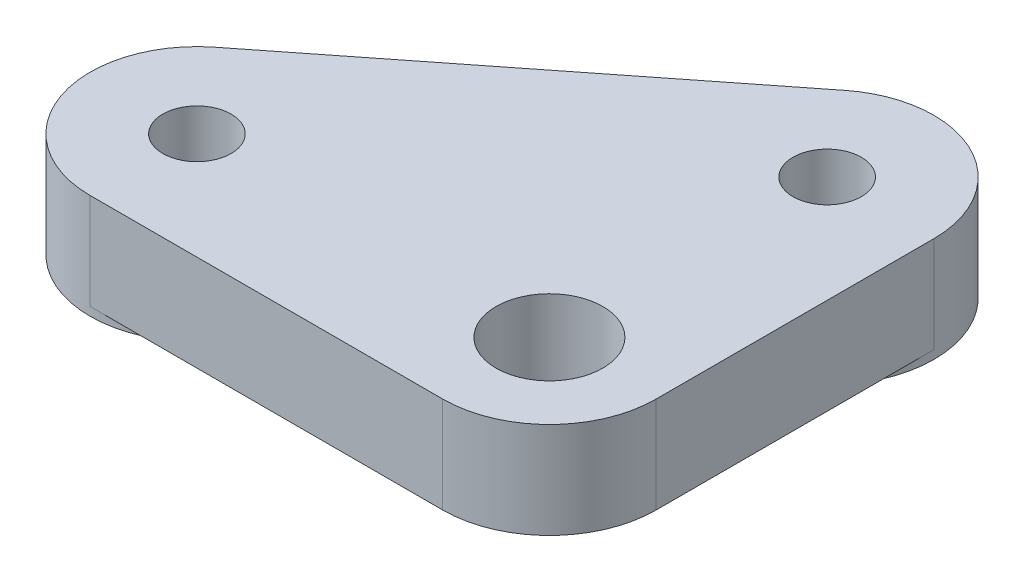
ISO-10303-21;
HEADER;
FILE_DESCRIPTION(('STEP AP214'),'2;1');
FILE_NAME('part.step','',(''),(''),'','','');
FILE_SCHEMA(('AUTOMOTIVE_DESIGN { 1 0 10303 214 1 1 1 1 }'));
ENDSEC;
DATA;
#1=APPLICATION_CONTEXT('core data for automotive mechanical design processes');
#2=APPLICATION_PROTOCOL_DEFINITION('international standard','automotive_design',2000,#1);
#3=PRODUCT_CONTEXT('',#1,'mechanical');
#4=PRODUCT('Part','Part','',(#3));
#5=PRODUCT_RELATED_PRODUCT_CATEGORY('part','',(#4));
#6=PRODUCT_DEFINITION_FORMATION('','',#4);
#7=PRODUCT_DEFINITION_CONTEXT('part definition',#1,'design');
#8=PRODUCT_DEFINITION('design','',#6,#7);
#9=PRODUCT_DEFINITION_SHAPE('','',#8);
#10=(LENGTH_UNIT() NAMED_UNIT(*) SI_UNIT(.MILLI.,.METRE.));
#11=(NAMED_UNIT(*) PLANE_ANGLE_UNIT() SI_UNIT($,.RADIAN.));
#12=(NAMED_UNIT(*) SI_UNIT($,.STERADIAN.) SOLID_ANGLE_UNIT());
#13=UNCERTAINTY_MEASURE_WITH_UNIT(LENGTH_MEASURE(1.E-05),#10,'distance_accuracy_value','');
#14=(GEOMETRIC_REPRESENTATION_CONTEXT(3) GLOBAL_UNCERTAINTY_ASSIGNED_CONTEXT((#13)) GLOBAL_UNIT_ASSIGNED_CONTEXT((#10,
#11,#12)) REPRESENTATION_CONTEXT('',''));
#15=CARTESIAN_POINT('',(0.,0.,0.));
#16=DIRECTION('',(0.,0.,1.));
#17=DIRECTION('',(1.,0.,0.));
#18=AXIS2_PLACEMENT_3D('',#15,#16,#17);
#19=CARTESIAN_POINT('',(-10.,0.,0.));
#20=DIRECTION('',(0.,1.,0.));
#21=DIRECTION('',(0.,0.,1.));
#22=AXIS2_PLACEMENT_3D('',#19,#20,#21);
#23=PLANE('',#22);
#24=CARTESIAN_POINT('',(-10.,0.,0.));
#25=DIRECTION('',(0.,-1.,0.));
#26=DIRECTION('',(0.,0.,1.));
#27=AXIS2_PLACEMENT_3D('',#24,#25,#26);
#28=CIRCLE('',#27,2.5);
#29=CARTESIAN_POINT('',(-10.,0.,2.5));
#30=VERTEX_POINT('',#29);
#31=EDGE_CURVE('E149',#30,#30,#28,.T.);
#32=ORIENTED_EDGE('',*,*,#31,.F.);
#33=EDGE_LOOP('',(#32));
#34=FACE_BOUND('',#33,.T.);
#35=CARTESIAN_POINT('',(-10.,0.,-13.));
#36=DIRECTION('',(0.,1.,0.));
#37=DIRECTION('',(0.,0.,-1.));
#38=AXIS2_PLACEMENT_3D('',#35,#36,#37);
#39=CIRCLE('',#38,4.99999999999997);
#40=CARTESIAN_POINT('',(-13.0943611330176,0.,-16.9274583611377));
#41=VERTEX_POINT('',#40);
#42=CARTESIAN_POINT('',(-5.00000000000001,0.,-13.));
#43=VERTEX_POINT('',#42);
#44=EDGE_CURVE('E104',#41,#43,#39,.T.);
#45=ORIENTED_EDGE('',*,*,#44,.T.);
#46=DIRECTION('',(0.,0.,1.));
#47=VECTOR('',#46,1.);
#48=CARTESIAN_POINT('',(-5.00000000000001,2.22044604925031E-13,-23.3048337992727));
#49=LINE('',#48,#47);
#50=CARTESIAN_POINT('',(-5.,0.,0.));
#51=VERTEX_POINT('',#50);
#52=EDGE_CURVE('E152',#43,#51,#49,.T.);
#53=ORIENTED_EDGE('',*,*,#52,.T.);
#54=CARTESIAN_POINT('',(-10.,0.,0.));
#55=DIRECTION('',(0.,-1.,0.));
#56=DIRECTION('',(0.,0.,1.));
#57=AXIS2_PLACEMENT_3D('',#54,#55,#56);
#58=CIRCLE('',#57,5.);
#59=CARTESIAN_POINT('',(-10.,1.11022302462516E-13,5.));
#60=VERTEX_POINT('',#59);
#61=EDGE_CURVE('E158',#60,#51,#58,.F.);
#62=ORIENTED_EDGE('',*,*,#61,.F.);
#63=DIRECTION('',(-1.,0.,0.));
#64=VECTOR('',#63,1.);
#65=CARTESIAN_POINT('',(-5.,1.11022302462516E-13,5.));
#66=LINE('',#65,#64);
#67=CARTESIAN_POINT('',(-26.5000000000001,1.11022302462516E-13,5.00000000000001));
#68=VERTEX_POINT('',#67);
#69=EDGE_CURVE('E107',#60,#68,#66,.T.);
#70=ORIENTED_EDGE('',*,*,#69,.T.);
#71=CARTESIAN_POINT('',(-26.5000000000001,0.,0.));
#72=DIRECTION('',(0.,1.,0.));
#73=DIRECTION('',(0.,0.,-1.));
#74=AXIS2_PLACEMENT_3D('',#71,#72,#73);
#75=CIRCLE('',#74,5.00000000000003);
#76=CARTESIAN_POINT('',(-29.5943611330177,0.,-3.9274583611377));
#77=VERTEX_POINT('',#76);
#78=EDGE_CURVE('E11',#68,#77,#75,.T.);
#79=ORIENTED_EDGE('',*,*,#78,.T.);
#80=DIRECTION('',(0.785491672227536,0.,-0.618872226603513));
#81=VECTOR('',#80,1.);
#82=CARTESIAN_POINT('',(-40.9253659760001,1.11022302462516E-13,5.00000000000001));
#83=LINE('',#82,#81);
#84=EDGE_CURVE('E94',#77,#41,#83,.T.);
#85=ORIENTED_EDGE('',*,*,#84,.T.);
#86=EDGE_LOOP('',(#45,#53,#62,#70,#79,#85));
#87=FACE_BOUND('',#86,.T.);
#88=ADVANCED_FACE('F34',(#34,#87),#23,.F.);
#89=CARTESIAN_POINT('',(-5.00000000000001,1.57000000000018,-23.3048337992727));
#90=DIRECTION('',(-1.,0.,0.));
#91=DIRECTION('',(0.,0.,-1.));
#92=AXIS2_PLACEMENT_3D('',#89,#90,#91);
#93=PLANE('',#92);
#94=DIRECTION('',(0.,-1.,0.));
#95=VECTOR('',#94,1.);
#96=CARTESIAN_POINT('',(-5.,1.56999999999996,0.));
#97=LINE('',#96,#95);
#98=CARTESIAN_POINT('',(-5.,4.49999999999996,0.));
#99=VERTEX_POINT('',#98);
#100=EDGE_CURVE('E106',#51,#99,#97,.F.);
#101=ORIENTED_EDGE('',*,*,#100,.F.);
#102=ORIENTED_EDGE('',*,*,#52,.F.);
#103=DIRECTION('',(0.,-1.,0.));
#104=VECTOR('',#103,1.);
#105=CARTESIAN_POINT('',(-5.00000000000001,1.56999999999996,-13.));
#106=LINE('',#105,#104);
#107=CARTESIAN_POINT('',(-5.00000000000006,4.49999999999996,-13.));
#108=VERTEX_POINT('',#107);
#109=EDGE_CURVE('E112',#108,#43,#106,.T.);
#110=ORIENTED_EDGE('',*,*,#109,.F.);
#111=DIRECTION('',(0.,0.,1.));
#112=VECTOR('',#111,1.);
#113=CARTESIAN_POINT('',(-5.00000000000004,4.49999999999996,-13.));
#114=LINE('',#113,#112);
#115=EDGE_CURVE('E142',#108,#99,#114,.T.);
#116=ORIENTED_EDGE('',*,*,#115,.T.);
#117=EDGE_LOOP('',(#101,#102,#110,#116));
#118=FACE_BOUND('',#117,.T.);
#119=ADVANCED_FACE('F170',(#118),#93,.F.);
#120=CARTESIAN_POINT('',(-5.,1.57000000000007,5.));
#121=DIRECTION('',(0.,0.,-1.));
#122=DIRECTION('',(1.,0.,0.));
#123=AXIS2_PLACEMENT_3D('',#120,#121,#122);
#124=PLANE('',#123);
#125=DIRECTION('',(0.,-1.,0.));
#126=VECTOR('',#125,1.);
#127=CARTESIAN_POINT('',(-26.5000000000001,1.57000000000007,5.00000000000001));
#128=LINE('',#127,#126);
#129=CARTESIAN_POINT('',(-26.5000000000001,4.49999999999996,5.00000000000001));
#130=VERTEX_POINT('',#129);
#131=EDGE_CURVE('E50',#68,#130,#128,.F.);
#132=ORIENTED_EDGE('',*,*,#131,.F.);
#133=ORIENTED_EDGE('',*,*,#69,.F.);
#134=DIRECTION('',(0.,-1.,0.));
#135=VECTOR('',#134,1.);
#136=CARTESIAN_POINT('',(-10.,1.57000000000007,5.));
#137=LINE('',#136,#135);
#138=CARTESIAN_POINT('',(-10.,4.49999999999996,5.));
#139=VERTEX_POINT('',#138);
#140=EDGE_CURVE('E38',#139,#60,#137,.T.);
#141=ORIENTED_EDGE('',*,*,#140,.F.);
#142=DIRECTION('',(-1.,0.,0.));
#143=VECTOR('',#142,1.);
#144=CARTESIAN_POINT('',(-10.,4.49999999999996,5.));
#145=LINE('',#144,#143);
#146=EDGE_CURVE('E147',#139,#130,#145,.T.);
#147=ORIENTED_EDGE('',*,*,#146,.T.);
#148=EDGE_LOOP('',(#132,#133,#141,#147));
#149=FACE_BOUND('',#148,.T.);
#150=ADVANCED_FACE('F163',(#149),#124,.F.);
#151=CARTESIAN_POINT('',(-40.9253659760001,1.57000000000007,5.00000000000001));
#152=DIRECTION('',(0.618872226603513,0.,0.785491672227536));
#153=DIRECTION('',(-0.785491672227536,0.,0.618872226603513));
#154=AXIS2_PLACEMENT_3D('',#151,#152,#153);
#155=PLANE('',#154);
#156=ORIENTED_EDGE('',*,*,#84,.F.);
#157=DIRECTION('',(0.,-1.,0.));
#158=VECTOR('',#157,1.);
#159=CARTESIAN_POINT('',(-29.5943611330177,1.56999999999996,-3.92745836113772));
#160=LINE('',#159,#158);
#161=CARTESIAN_POINT('',(-29.5943611330177,4.49999999999996,-3.92745836113772));
#162=VERTEX_POINT('',#161);
#163=EDGE_CURVE('E99',#162,#77,#160,.T.);
#164=ORIENTED_EDGE('',*,*,#163,.F.);
#165=DIRECTION('',(0.785491672227541,0.,-0.618872226603506));
#166=VECTOR('',#165,1.);
#167=CARTESIAN_POINT('',(-29.5943611330177,4.49999999999996,-3.92745836113772));
#168=LINE('',#167,#166);
#169=CARTESIAN_POINT('',(-13.0943611330175,4.49999999999996,-16.9274583611376));
#170=VERTEX_POINT('',#169);
#171=EDGE_CURVE('E96',#162,#170,#168,.T.);
#172=ORIENTED_EDGE('',*,*,#171,.T.);
#173=DIRECTION('',(0.,-1.,0.));
#174=VECTOR('',#173,1.);
#175=CARTESIAN_POINT('',(-13.0943611330175,1.56999999999996,-16.9274583611376));
#176=LINE('',#175,#174);
#177=EDGE_CURVE('E90',#41,#170,#176,.F.);
#178=ORIENTED_EDGE('',*,*,#177,.F.);
#179=EDGE_LOOP('',(#156,#164,#172,#178));
#180=FACE_BOUND('',#179,.T.);
#181=ADVANCED_FACE('F92',(#180),#155,.F.);
#182=CARTESIAN_POINT('',(-26.5000000000001,1.56999999999996,0.));
#183=DIRECTION('',(0.,-1.,0.));
#184=DIRECTION('',(0.,0.,-1.));
#185=AXIS2_PLACEMENT_3D('',#182,#183,#184);
#186=CYLINDRICAL_SURFACE('',#185,1.6);
#187=CARTESIAN_POINT('',(-26.5000000000001,4.49999999999996,0.));
#188=DIRECTION('',(0.,-1.,0.));
#189=DIRECTION('',(0.,0.,1.));
#190=AXIS2_PLACEMENT_3D('',#187,#188,#189);
#191=CIRCLE('',#190,1.6);
#192=CARTESIAN_POINT('',(-26.5000000000001,4.49999999999996,1.6));
#193=VERTEX_POINT('',#192);
#194=EDGE_CURVE('E131',#193,#193,#191,.T.);
#195=ORIENTED_EDGE('',*,*,#194,.F.);
#196=EDGE_LOOP('',(#195));
#197=FACE_BOUND('',#196,.T.);
#198=CARTESIAN_POINT('',(-26.5000000000001,-0.4,0.));
#199=DIRECTION('',(0.,1.,0.));
#200=DIRECTION('',(0.,0.,-1.));
#201=AXIS2_PLACEMENT_3D('',#198,#199,#200);
#202=CIRCLE('',#201,1.6);
#203=CARTESIAN_POINT('',(-26.5000000000001,-0.4,-1.6));
#204=VERTEX_POINT('',#203);
#205=EDGE_CURVE('E118',#204,#204,#202,.T.);
#206=ORIENTED_EDGE('',*,*,#205,.F.);
#207=EDGE_LOOP('',(#206));
#208=FACE_BOUND('',#207,.T.);
#209=ADVANCED_FACE('F189',(#197,#208),#186,.F.);
#210=CARTESIAN_POINT('',(-10.,1.56999999999996,0.));
#211=DIRECTION('',(0.,-1.,0.));
#212=DIRECTION('',(0.,0.,-1.));
#213=AXIS2_PLACEMENT_3D('',#210,#211,#212);
#214=CYLINDRICAL_SURFACE('',#213,2.5);
#215=ORIENTED_EDGE('',*,*,#31,.T.);
#216=EDGE_LOOP('',(#215));
#217=FACE_BOUND('',#216,.T.);
#218=CARTESIAN_POINT('',(-10.,4.49999999999996,0.));
#219=DIRECTION('',(0.,-1.,0.));
#220=DIRECTION('',(0.,0.,1.));
#221=AXIS2_PLACEMENT_3D('',#218,#219,#220);
#222=CIRCLE('',#221,2.5);
#223=CARTESIAN_POINT('',(-10.,4.49999999999996,2.5));
#224=VERTEX_POINT('',#223);
#225=EDGE_CURVE('E134',#224,#224,#222,.T.);
#226=ORIENTED_EDGE('',*,*,#225,.F.);
#227=EDGE_LOOP('',(#226));
#228=FACE_BOUND('',#227,.T.);
#229=ADVANCED_FACE('F208',(#217,#228),#214,.F.);
#230=CARTESIAN_POINT('',(-10.,1.56999999999996,-13.));
#231=DIRECTION('',(0.,-1.,0.));
#232=DIRECTION('',(0.,0.,-1.));
#233=AXIS2_PLACEMENT_3D('',#230,#231,#232);
#234=CYLINDRICAL_SURFACE('',#233,1.6);
#235=CARTESIAN_POINT('',(-10.,4.49999999999996,-13.));
#236=DIRECTION('',(0.,-1.,0.));
#237=DIRECTION('',(0.,0.,1.));
#238=AXIS2_PLACEMENT_3D('',#235,#236,#237);
#239=CIRCLE('',#238,1.6);
#240=CARTESIAN_POINT('',(-10.,4.49999999999996,-11.4));
#241=VERTEX_POINT('',#240);
#242=EDGE_CURVE('E127',#241,#241,#239,.T.);
#243=ORIENTED_EDGE('',*,*,#242,.F.);
#244=EDGE_LOOP('',(#243));
#245=FACE_BOUND('',#244,.T.);
#246=CARTESIAN_POINT('',(-10.,-0.4,-13.));
#247=DIRECTION('',(0.,1.,0.));
#248=DIRECTION('',(0.,0.,-1.));
#249=AXIS2_PLACEMENT_3D('',#246,#247,#248);
#250=CIRCLE('',#249,1.6);
#251=CARTESIAN_POINT('',(-10.,-0.4,-14.6));
#252=VERTEX_POINT('',#251);
#253=EDGE_CURVE('E115',#252,#252,#250,.T.);
#254=ORIENTED_EDGE('',*,*,#253,.F.);
#255=EDGE_LOOP('',(#254));
#256=FACE_BOUND('',#255,.T.);
#257=ADVANCED_FACE('F177',(#245,#256),#234,.F.);
#258=CARTESIAN_POINT('',(-10.,1.56999999999996,-13.));
#259=DIRECTION('',(0.,-1.,0.));
#260=DIRECTION('',(0.,0.,-1.));
#261=AXIS2_PLACEMENT_3D('',#258,#259,#260);
#262=CYLINDRICAL_SURFACE('',#261,5.);
#263=ORIENTED_EDGE('',*,*,#109,.T.);
#264=ORIENTED_EDGE('',*,*,#44,.F.);
#265=ORIENTED_EDGE('',*,*,#177,.T.);
#266=CARTESIAN_POINT('',(-10.,4.49999999999996,-13.));
#267=DIRECTION('',(0.,-1.,0.));
#268=DIRECTION('',(0.,0.,1.));
#269=AXIS2_PLACEMENT_3D('',#266,#267,#268);
#270=CIRCLE('',#269,4.99999999999995);
#271=EDGE_CURVE('E140',#170,#108,#270,.T.);
#272=ORIENTED_EDGE('',*,*,#271,.T.);
#273=EDGE_LOOP('',(#263,#264,#265,#272));
#274=FACE_BOUND('',#273,.T.);
#275=CARTESIAN_POINT('',(-10.,-0.4,-13.));
#276=DIRECTION('',(0.,1.,0.));
#277=DIRECTION('',(0.,0.,-1.));
#278=AXIS2_PLACEMENT_3D('',#275,#276,#277);
#279=CIRCLE('',#278,4.99999999999997);
#280=CARTESIAN_POINT('',(-10.,-0.4,-18.));
#281=VERTEX_POINT('',#280);
#282=EDGE_CURVE('E114',#281,#281,#279,.T.);
#283=ORIENTED_EDGE('',*,*,#282,.T.);
#284=EDGE_LOOP('',(#283));
#285=FACE_BOUND('',#284,.T.);
#286=ADVANCED_FACE('F109',(#274,#285),#262,.T.);
#287=CARTESIAN_POINT('',(-10.,1.56999999999996,0.));
#288=DIRECTION('',(0.,-1.,0.));
#289=DIRECTION('',(0.,0.,-1.));
#290=AXIS2_PLACEMENT_3D('',#287,#288,#289);
#291=CYLINDRICAL_SURFACE('',#290,5.);
#292=ORIENTED_EDGE('',*,*,#140,.T.);
#293=ORIENTED_EDGE('',*,*,#61,.T.);
#294=ORIENTED_EDGE('',*,*,#100,.T.);
#295=CARTESIAN_POINT('',(-10.,4.49999999999996,0.));
#296=DIRECTION('',(0.,-1.,0.));
#297=DIRECTION('',(0.,0.,1.));
#298=AXIS2_PLACEMENT_3D('',#295,#296,#297);
#299=CIRCLE('',#298,5.);
#300=EDGE_CURVE('E145',#99,#139,#299,.T.);
#301=ORIENTED_EDGE('',*,*,#300,.T.);
#302=EDGE_LOOP('',(#292,#293,#294,#301));
#303=FACE_BOUND('',#302,.T.);
#304=ADVANCED_FACE('F171',(#303),#291,.T.);
#305=CARTESIAN_POINT('',(-26.5000000000001,1.56999999999996,0.));
#306=DIRECTION('',(0.,-1.,0.));
#307=DIRECTION('',(0.,0.,-1.));
#308=AXIS2_PLACEMENT_3D('',#305,#306,#307);
#309=CYLINDRICAL_SURFACE('',#308,5.);
#310=ORIENTED_EDGE('',*,*,#163,.T.);
#311=ORIENTED_EDGE('',*,*,#78,.F.);
#312=ORIENTED_EDGE('',*,*,#131,.T.);
#313=CARTESIAN_POINT('',(-26.5000000000001,4.49999999999996,0.));
#314=DIRECTION('',(0.,-1.,0.));
#315=DIRECTION('',(0.,0.,1.));
#316=AXIS2_PLACEMENT_3D('',#313,#314,#315);
#317=CIRCLE('',#316,5.00000000000003);
#318=EDGE_CURVE('E137',#130,#162,#317,.T.);
#319=ORIENTED_EDGE('',*,*,#318,.T.);
#320=EDGE_LOOP('',(#310,#311,#312,#319));
#321=FACE_BOUND('',#320,.T.);
#322=CARTESIAN_POINT('',(-26.5000000000001,-0.4,0.));
#323=DIRECTION('',(0.,1.,0.));
#324=DIRECTION('',(0.,0.,-1.));
#325=AXIS2_PLACEMENT_3D('',#322,#323,#324);
#326=CIRCLE('',#325,5.00000000000003);
#327=CARTESIAN_POINT('',(-26.5000000000001,-0.4,-5.00000000000003));
#328=VERTEX_POINT('',#327);
#329=EDGE_CURVE('E125',#328,#328,#326,.T.);
#330=ORIENTED_EDGE('',*,*,#329,.T.);
#331=EDGE_LOOP('',(#330));
#332=FACE_BOUND('',#331,.T.);
#333=ADVANCED_FACE('F36',(#321,#332),#309,.T.);
#334=CARTESIAN_POINT('',(-26.5000000000001,4.49999999999996,0.));
#335=DIRECTION('',(0.,1.,0.));
#336=DIRECTION('',(0.,0.,1.));
#337=AXIS2_PLACEMENT_3D('',#334,#335,#336);
#338=PLANE('',#337);
#339=ORIENTED_EDGE('',*,*,#194,.T.);
#340=EDGE_LOOP('',(#339));
#341=FACE_BOUND('',#340,.T.);
#342=ORIENTED_EDGE('',*,*,#318,.F.);
#343=ORIENTED_EDGE('',*,*,#146,.F.);
#344=ORIENTED_EDGE('',*,*,#300,.F.);
#345=ORIENTED_EDGE('',*,*,#115,.F.);
#346=ORIENTED_EDGE('',*,*,#271,.F.);
#347=ORIENTED_EDGE('',*,*,#171,.F.);
#348=EDGE_LOOP('',(#342,#343,#344,#345,#346,#347));
#349=FACE_BOUND('',#348,.T.);
#350=ORIENTED_EDGE('',*,*,#225,.T.);
#351=EDGE_LOOP('',(#350));
#352=FACE_BOUND('',#351,.T.);
#353=ORIENTED_EDGE('',*,*,#242,.T.);
#354=EDGE_LOOP('',(#353));
#355=FACE_BOUND('',#354,.T.);
#356=ADVANCED_FACE('F166',(#341,#349,#352,#355),#338,.T.);
#357=CARTESIAN_POINT('',(-26.5000000000001,-0.4,0.));
#358=DIRECTION('',(0.,-1.,0.));
#359=DIRECTION('',(0.,0.,-1.));
#360=AXIS2_PLACEMENT_3D('',#357,#358,#359);
#361=PLANE('',#360);
#362=ORIENTED_EDGE('',*,*,#329,.F.);
#363=EDGE_LOOP('',(#362));
#364=FACE_BOUND('',#363,.T.);
#365=ORIENTED_EDGE('',*,*,#205,.T.);
#366=EDGE_LOOP('',(#365));
#367=FACE_BOUND('',#366,.T.);
#368=ADVANCED_FACE('F249',(#364,#367),#361,.T.);
#369=CARTESIAN_POINT('',(-10.,-0.4,-13.));
#370=DIRECTION('',(0.,-1.,0.));
#371=DIRECTION('',(0.,0.,-1.));
#372=AXIS2_PLACEMENT_3D('',#369,#370,#371);
#373=PLANE('',#372);
#374=ORIENTED_EDGE('',*,*,#282,.F.);
#375=EDGE_LOOP('',(#374));
#376=FACE_BOUND('',#375,.T.);
#377=ORIENTED_EDGE('',*,*,#253,.T.);
#378=EDGE_LOOP('',(#377));
#379=FACE_BOUND('',#378,.T.);
#380=ADVANCED_FACE('F259',(#376,#379),#373,.T.);
#381=CLOSED_SHELL('',(#88,#119,#150,#181,#209,#229,#257,#286,#304,#333,#356,#368,#380));
#382=MANIFOLD_SOLID_BREP('B2',#381);
#383=ADVANCED_BREP_SHAPE_REPRESENTATION('',(#18,#382),#14);
#384=SHAPE_DEFINITION_REPRESENTATION(#9,#383);
ENDSEC;
END-ISO-10303-21;
